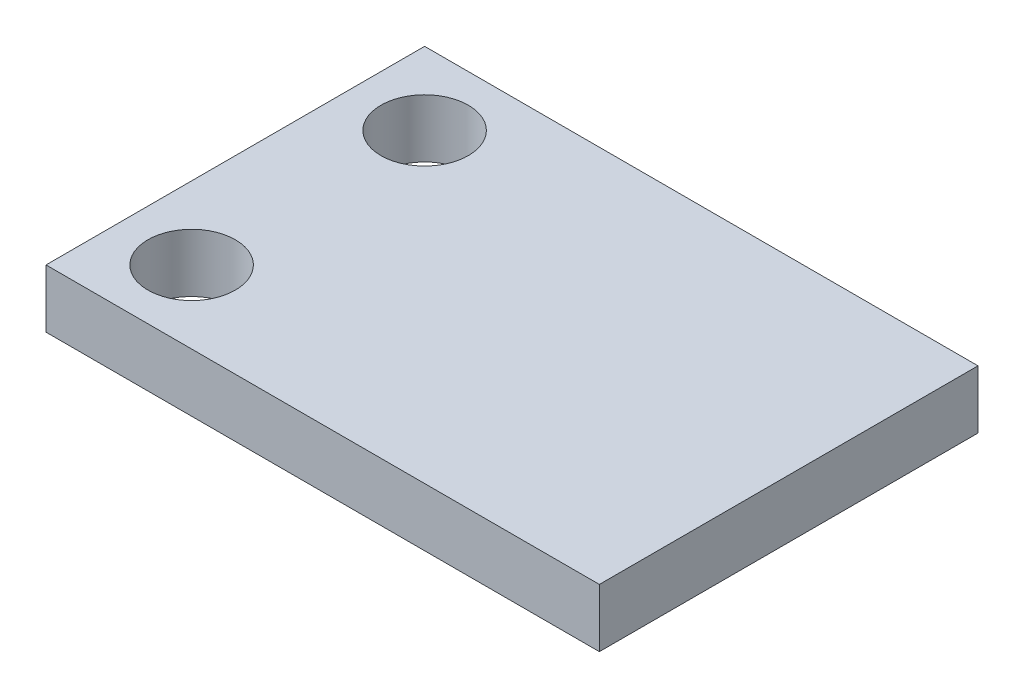
ISO-10303-21;
HEADER;
FILE_DESCRIPTION(('STEP AP214'),'2;1');
FILE_NAME('part.step','',(''),(''),'','','');
FILE_SCHEMA(('AUTOMOTIVE_DESIGN { 1 0 10303 214 1 1 1 1 }'));
ENDSEC;
DATA;
#1=APPLICATION_CONTEXT('core data for automotive mechanical design processes');
#2=APPLICATION_PROTOCOL_DEFINITION('international standard','automotive_design',2000,#1);
#3=PRODUCT_CONTEXT('',#1,'mechanical');
#4=PRODUCT('Part','Part','',(#3));
#5=PRODUCT_RELATED_PRODUCT_CATEGORY('part','',(#4));
#6=PRODUCT_DEFINITION_FORMATION('','',#4);
#7=PRODUCT_DEFINITION_CONTEXT('part definition',#1,'design');
#8=PRODUCT_DEFINITION('design','',#6,#7);
#9=PRODUCT_DEFINITION_SHAPE('','',#8);
#10=(LENGTH_UNIT() NAMED_UNIT(*) SI_UNIT(.MILLI.,.METRE.));
#11=(NAMED_UNIT(*) PLANE_ANGLE_UNIT() SI_UNIT($,.RADIAN.));
#12=(NAMED_UNIT(*) SI_UNIT($,.STERADIAN.) SOLID_ANGLE_UNIT());
#13=UNCERTAINTY_MEASURE_WITH_UNIT(LENGTH_MEASURE(1.E-05),#10,'distance_accuracy_value','');
#14=(GEOMETRIC_REPRESENTATION_CONTEXT(3) GLOBAL_UNCERTAINTY_ASSIGNED_CONTEXT((#13)) GLOBAL_UNIT_ASSIGNED_CONTEXT((#10,
#11,#12)) REPRESENTATION_CONTEXT('',''));
#15=CARTESIAN_POINT('',(0.,0.,0.));
#16=DIRECTION('',(0.,0.,1.));
#17=DIRECTION('',(1.,0.,0.));
#18=AXIS2_PLACEMENT_3D('',#15,#16,#17);
#19=CARTESIAN_POINT('',(0.,2.,0.));
#20=DIRECTION('',(0.,-1.,0.));
#21=DIRECTION('',(0.,0.,-1.));
#22=AXIS2_PLACEMENT_3D('',#19,#20,#21);
#23=PLANE('',#22);
#24=CARTESIAN_POINT('',(-7.,2.,-4.));
#25=DIRECTION('',(0.,1.,0.));
#26=DIRECTION('',(0.,0.,1.));
#27=AXIS2_PLACEMENT_3D('',#24,#25,#26);
#28=CIRCLE('',#27,1.5);
#29=CARTESIAN_POINT('',(-7.,2.,-2.5));
#30=VERTEX_POINT('',#29);
#31=EDGE_CURVE('E100',#30,#30,#28,.T.);
#32=ORIENTED_EDGE('',*,*,#31,.F.);
#33=EDGE_LOOP('',(#32));
#34=FACE_BOUND('',#33,.T.);
#35=DIRECTION('',(0.,0.,-1.));
#36=VECTOR('',#35,1.);
#37=CARTESIAN_POINT('',(9.5,2.,6.5));
#38=LINE('',#37,#36);
#39=CARTESIAN_POINT('',(9.5,2.,6.5));
#40=VERTEX_POINT('',#39);
#41=CARTESIAN_POINT('',(9.5,2.,-6.5));
#42=VERTEX_POINT('',#41);
#43=EDGE_CURVE('E85',#40,#42,#38,.T.);
#44=ORIENTED_EDGE('',*,*,#43,.T.);
#45=DIRECTION('',(-1.,0.,0.));
#46=VECTOR('',#45,1.);
#47=CARTESIAN_POINT('',(-9.5,2.,-6.5));
#48=LINE('',#47,#46);
#49=CARTESIAN_POINT('',(-9.5,2.,-6.5));
#50=VERTEX_POINT('',#49);
#51=EDGE_CURVE('E80',#42,#50,#48,.T.);
#52=ORIENTED_EDGE('',*,*,#51,.T.);
#53=DIRECTION('',(0.,0.,1.));
#54=VECTOR('',#53,1.);
#55=CARTESIAN_POINT('',(-9.5,2.,6.5));
#56=LINE('',#55,#54);
#57=CARTESIAN_POINT('',(-9.5,2.,6.5));
#58=VERTEX_POINT('',#57);
#59=EDGE_CURVE('E83',#50,#58,#56,.T.);
#60=ORIENTED_EDGE('',*,*,#59,.T.);
#61=DIRECTION('',(1.,0.,0.));
#62=VECTOR('',#61,1.);
#63=CARTESIAN_POINT('',(-9.5,2.,6.5));
#64=LINE('',#63,#62);
#65=EDGE_CURVE('E50',#58,#40,#64,.T.);
#66=ORIENTED_EDGE('',*,*,#65,.T.);
#67=EDGE_LOOP('',(#44,#52,#60,#66));
#68=FACE_BOUND('',#67,.T.);
#69=CARTESIAN_POINT('',(-7.,2.,4.));
#70=DIRECTION('',(0.,1.,0.));
#71=DIRECTION('',(0.,0.,-1.));
#72=AXIS2_PLACEMENT_3D('',#69,#70,#71);
#73=CIRCLE('',#72,1.5);
#74=CARTESIAN_POINT('',(-7.,2.,2.5));
#75=VERTEX_POINT('',#74);
#76=EDGE_CURVE('E115',#75,#75,#73,.T.);
#77=ORIENTED_EDGE('',*,*,#76,.F.);
#78=EDGE_LOOP('',(#77));
#79=FACE_BOUND('',#78,.T.);
#80=ADVANCED_FACE('F33',(#34,#68,#79),#23,.F.);
#81=CARTESIAN_POINT('',(0.,0.,0.));
#82=DIRECTION('',(0.,-1.,0.));
#83=DIRECTION('',(0.,0.,-1.));
#84=AXIS2_PLACEMENT_3D('',#81,#82,#83);
#85=PLANE('',#84);
#86=CARTESIAN_POINT('',(-7.,0.,-4.));
#87=DIRECTION('',(0.,1.,0.));
#88=DIRECTION('',(0.,0.,1.));
#89=AXIS2_PLACEMENT_3D('',#86,#87,#88);
#90=CIRCLE('',#89,1.5);
#91=CARTESIAN_POINT('',(-7.,0.,-2.5));
#92=VERTEX_POINT('',#91);
#93=EDGE_CURVE('E112',#92,#92,#90,.T.);
#94=ORIENTED_EDGE('',*,*,#93,.T.);
#95=EDGE_LOOP('',(#94));
#96=FACE_BOUND('',#95,.T.);
#97=DIRECTION('',(0.,0.,-1.));
#98=VECTOR('',#97,1.);
#99=CARTESIAN_POINT('',(9.5,0.,6.5));
#100=LINE('',#99,#98);
#101=CARTESIAN_POINT('',(9.5,0.,6.5));
#102=VERTEX_POINT('',#101);
#103=CARTESIAN_POINT('',(9.5,0.,-6.5));
#104=VERTEX_POINT('',#103);
#105=EDGE_CURVE('E97',#102,#104,#100,.T.);
#106=ORIENTED_EDGE('',*,*,#105,.F.);
#107=DIRECTION('',(1.,0.,0.));
#108=VECTOR('',#107,1.);
#109=CARTESIAN_POINT('',(-9.5,0.,6.5));
#110=LINE('',#109,#108);
#111=CARTESIAN_POINT('',(-9.5,0.,6.5));
#112=VERTEX_POINT('',#111);
#113=EDGE_CURVE('E73',#112,#102,#110,.T.);
#114=ORIENTED_EDGE('',*,*,#113,.F.);
#115=DIRECTION('',(0.,0.,1.));
#116=VECTOR('',#115,1.);
#117=CARTESIAN_POINT('',(-9.5,0.,6.5));
#118=LINE('',#117,#116);
#119=CARTESIAN_POINT('',(-9.5,0.,-6.5));
#120=VERTEX_POINT('',#119);
#121=EDGE_CURVE('E67',#120,#112,#118,.T.);
#122=ORIENTED_EDGE('',*,*,#121,.F.);
#123=DIRECTION('',(-1.,0.,0.));
#124=VECTOR('',#123,1.);
#125=CARTESIAN_POINT('',(-9.5,0.,-6.5));
#126=LINE('',#125,#124);
#127=EDGE_CURVE('E89',#104,#120,#126,.T.);
#128=ORIENTED_EDGE('',*,*,#127,.F.);
#129=EDGE_LOOP('',(#106,#114,#122,#128));
#130=FACE_BOUND('',#129,.T.);
#131=CARTESIAN_POINT('',(-7.,0.,4.));
#132=DIRECTION('',(0.,1.,0.));
#133=DIRECTION('',(0.,0.,-1.));
#134=AXIS2_PLACEMENT_3D('',#131,#132,#133);
#135=CIRCLE('',#134,1.5);
#136=CARTESIAN_POINT('',(-7.,0.,2.5));
#137=VERTEX_POINT('',#136);
#138=EDGE_CURVE('E118',#137,#137,#135,.T.);
#139=ORIENTED_EDGE('',*,*,#138,.T.);
#140=EDGE_LOOP('',(#139));
#141=FACE_BOUND('',#140,.T.);
#142=ADVANCED_FACE('F108',(#96,#130,#141),#85,.T.);
#143=CARTESIAN_POINT('',(9.5,2.,6.5));
#144=DIRECTION('',(-1.,0.,0.));
#145=DIRECTION('',(0.,0.,1.));
#146=AXIS2_PLACEMENT_3D('',#143,#144,#145);
#147=PLANE('',#146);
#148=ORIENTED_EDGE('',*,*,#105,.T.);
#149=DIRECTION('',(0.,-1.,0.));
#150=VECTOR('',#149,1.);
#151=CARTESIAN_POINT('',(9.5,2.,-6.5));
#152=LINE('',#151,#150);
#153=EDGE_CURVE('E11',#42,#104,#152,.T.);
#154=ORIENTED_EDGE('',*,*,#153,.F.);
#155=ORIENTED_EDGE('',*,*,#43,.F.);
#156=DIRECTION('',(0.,-1.,0.));
#157=VECTOR('',#156,1.);
#158=CARTESIAN_POINT('',(9.5,2.,6.5));
#159=LINE('',#158,#157);
#160=EDGE_CURVE('E93',#40,#102,#159,.T.);
#161=ORIENTED_EDGE('',*,*,#160,.T.);
#162=EDGE_LOOP('',(#148,#154,#155,#161));
#163=FACE_BOUND('',#162,.T.);
#164=ADVANCED_FACE('F35',(#163),#147,.F.);
#165=CARTESIAN_POINT('',(-9.5,2.,-6.5));
#166=DIRECTION('',(0.,0.,1.));
#167=DIRECTION('',(1.,0.,0.));
#168=AXIS2_PLACEMENT_3D('',#165,#166,#167);
#169=PLANE('',#168);
#170=ORIENTED_EDGE('',*,*,#127,.T.);
#171=DIRECTION('',(0.,-1.,0.));
#172=VECTOR('',#171,1.);
#173=CARTESIAN_POINT('',(-9.5,2.,-6.5));
#174=LINE('',#173,#172);
#175=EDGE_CURVE('E42',#50,#120,#174,.T.);
#176=ORIENTED_EDGE('',*,*,#175,.F.);
#177=ORIENTED_EDGE('',*,*,#51,.F.);
#178=ORIENTED_EDGE('',*,*,#153,.T.);
#179=EDGE_LOOP('',(#170,#176,#177,#178));
#180=FACE_BOUND('',#179,.T.);
#181=ADVANCED_FACE('F88',(#180),#169,.F.);
#182=CARTESIAN_POINT('',(-9.5,2.,6.5));
#183=DIRECTION('',(1.,0.,0.));
#184=DIRECTION('',(0.,0.,-1.));
#185=AXIS2_PLACEMENT_3D('',#182,#183,#184);
#186=PLANE('',#185);
#187=ORIENTED_EDGE('',*,*,#121,.T.);
#188=DIRECTION('',(0.,-1.,0.));
#189=VECTOR('',#188,1.);
#190=CARTESIAN_POINT('',(-9.5,2.,6.5));
#191=LINE('',#190,#189);
#192=EDGE_CURVE('E90',#58,#112,#191,.T.);
#193=ORIENTED_EDGE('',*,*,#192,.F.);
#194=ORIENTED_EDGE('',*,*,#59,.F.);
#195=ORIENTED_EDGE('',*,*,#175,.T.);
#196=EDGE_LOOP('',(#187,#193,#194,#195));
#197=FACE_BOUND('',#196,.T.);
#198=ADVANCED_FACE('F91',(#197),#186,.F.);
#199=CARTESIAN_POINT('',(-9.5,2.,6.5));
#200=DIRECTION('',(0.,0.,-1.));
#201=DIRECTION('',(-1.,0.,0.));
#202=AXIS2_PLACEMENT_3D('',#199,#200,#201);
#203=PLANE('',#202);
#204=ORIENTED_EDGE('',*,*,#113,.T.);
#205=ORIENTED_EDGE('',*,*,#160,.F.);
#206=ORIENTED_EDGE('',*,*,#65,.F.);
#207=ORIENTED_EDGE('',*,*,#192,.T.);
#208=EDGE_LOOP('',(#204,#205,#206,#207));
#209=FACE_BOUND('',#208,.T.);
#210=ADVANCED_FACE('F105',(#209),#203,.F.);
#211=CARTESIAN_POINT('',(-7.,2.,-4.));
#212=DIRECTION('',(0.,-1.,0.));
#213=DIRECTION('',(0.,0.,-1.));
#214=AXIS2_PLACEMENT_3D('',#211,#212,#213);
#215=CYLINDRICAL_SURFACE('',#214,1.5);
#216=ORIENTED_EDGE('',*,*,#31,.T.);
#217=EDGE_LOOP('',(#216));
#218=FACE_BOUND('',#217,.T.);
#219=ORIENTED_EDGE('',*,*,#93,.F.);
#220=EDGE_LOOP('',(#219));
#221=FACE_BOUND('',#220,.T.);
#222=ADVANCED_FACE('F136',(#218,#221),#215,.F.);
#223=CARTESIAN_POINT('',(-7.,2.,4.));
#224=DIRECTION('',(0.,-1.,0.));
#225=DIRECTION('',(0.,0.,-1.));
#226=AXIS2_PLACEMENT_3D('',#223,#224,#225);
#227=CYLINDRICAL_SURFACE('',#226,1.5);
#228=ORIENTED_EDGE('',*,*,#76,.T.);
#229=EDGE_LOOP('',(#228));
#230=FACE_BOUND('',#229,.T.);
#231=ORIENTED_EDGE('',*,*,#138,.F.);
#232=EDGE_LOOP('',(#231));
#233=FACE_BOUND('',#232,.T.);
#234=ADVANCED_FACE('F124',(#230,#233),#227,.F.);
#235=CLOSED_SHELL('',(#80,#142,#164,#181,#198,#210,#222,#234));
#236=MANIFOLD_SOLID_BREP('B2',#235);
#237=ADVANCED_BREP_SHAPE_REPRESENTATION('',(#18,#236),#14);
#238=SHAPE_DEFINITION_REPRESENTATION(#9,#237);
ENDSEC;
END-ISO-10303-21;
